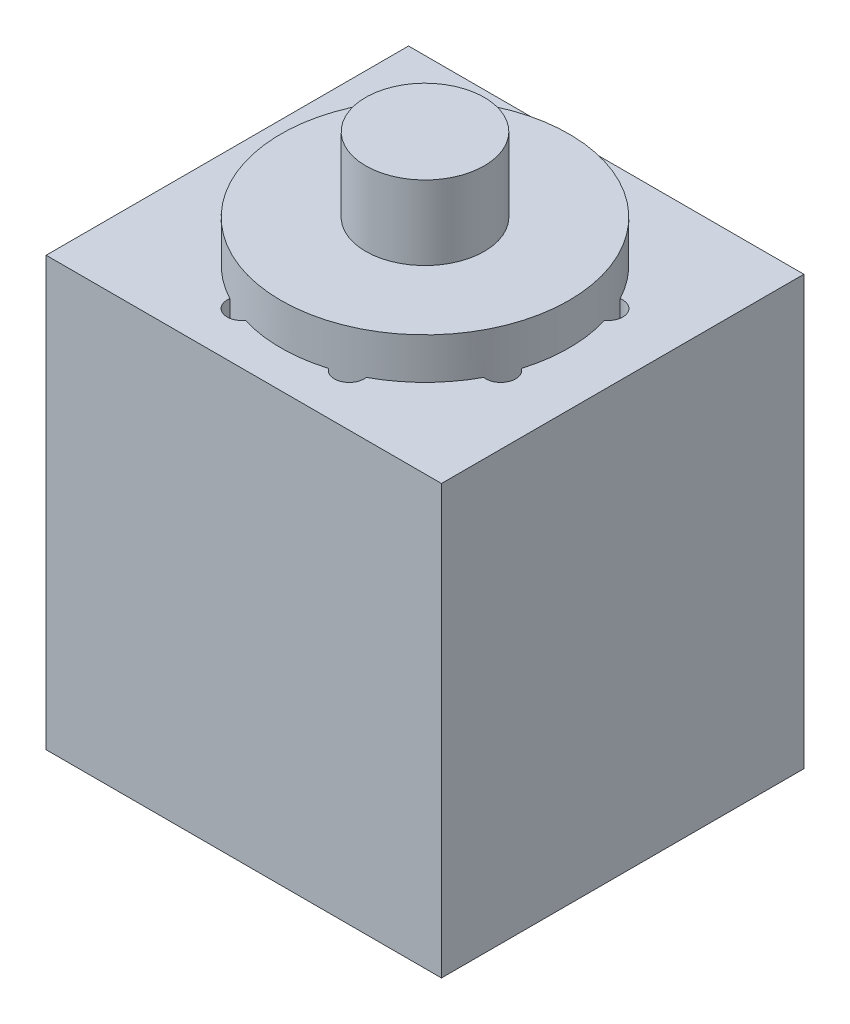
ISO-10303-21;
HEADER;
FILE_DESCRIPTION(('STEP AP214'),'2;1');
FILE_NAME('part.step','',(''),(''),'','','');
FILE_SCHEMA(('AUTOMOTIVE_DESIGN { 1 0 10303 214 1 1 1 1 }'));
ENDSEC;
DATA;
#1=APPLICATION_CONTEXT('core data for automotive mechanical design processes');
#2=APPLICATION_PROTOCOL_DEFINITION('international standard','automotive_design',2000,#1);
#3=PRODUCT_CONTEXT('',#1,'mechanical');
#4=PRODUCT('Part','Part','',(#3));
#5=PRODUCT_RELATED_PRODUCT_CATEGORY('part','',(#4));
#6=PRODUCT_DEFINITION_FORMATION('','',#4);
#7=PRODUCT_DEFINITION_CONTEXT('part definition',#1,'design');
#8=PRODUCT_DEFINITION('design','',#6,#7);
#9=PRODUCT_DEFINITION_SHAPE('','',#8);
#10=(LENGTH_UNIT() NAMED_UNIT(*) SI_UNIT(.MILLI.,.METRE.));
#11=(NAMED_UNIT(*) PLANE_ANGLE_UNIT() SI_UNIT($,.RADIAN.));
#12=(NAMED_UNIT(*) SI_UNIT($,.STERADIAN.) SOLID_ANGLE_UNIT());
#13=UNCERTAINTY_MEASURE_WITH_UNIT(LENGTH_MEASURE(1.E-05),#10,'distance_accuracy_value','');
#14=(GEOMETRIC_REPRESENTATION_CONTEXT(3) GLOBAL_UNCERTAINTY_ASSIGNED_CONTEXT((#13)) GLOBAL_UNIT_ASSIGNED_CONTEXT((#10,
#11,#12)) REPRESENTATION_CONTEXT('',''));
#15=CARTESIAN_POINT('',(0.,0.,0.));
#16=DIRECTION('',(0.,0.,1.));
#17=DIRECTION('',(1.,0.,0.));
#18=AXIS2_PLACEMENT_3D('',#15,#16,#17);
#19=CARTESIAN_POINT('',(78.5297602634594,260.,-32.5280917510326));
#20=DIRECTION('',(0.,-1.,0.));
#21=DIRECTION('',(0.,0.,-1.));
#22=AXIS2_PLACEMENT_3D('',#19,#20,#21);
#23=CYLINDRICAL_SURFACE('',#22,9.);
#24=CARTESIAN_POINT('',(78.5297602634594,260.,-32.5280917510326));
#25=DIRECTION('',(0.,1.,0.));
#26=DIRECTION('',(0.,0.,1.));
#27=AXIS2_PLACEMENT_3D('',#24,#25,#26);
#28=CIRCLE('',#27,9.);
#29=CARTESIAN_POINT('',(83.785914847198,260.,-25.222420050782));
#30=VERTEX_POINT('',#29);
#31=CARTESIAN_POINT('',(77.0805328122158,260.,-41.4106443005289));
#32=VERTEX_POINT('',#31);
#33=EDGE_CURVE('E249',#30,#32,#28,.T.);
#34=ORIENTED_EDGE('',*,*,#33,.T.);
#35=DIRECTION('',(0.,-1.,0.));
#36=VECTOR('',#35,1.);
#37=CARTESIAN_POINT('',(77.0805328122158,142.5,-41.4106443005289));
#38=LINE('',#37,#36);
#39=CARTESIAN_POINT('',(77.0805328122158,0.,-41.4106443005289));
#40=VERTEX_POINT('',#39);
#41=EDGE_CURVE('E331',#32,#40,#38,.T.);
#42=ORIENTED_EDGE('',*,*,#41,.T.);
#43=CARTESIAN_POINT('',(78.5297602634594,0.,-32.5280917510326));
#44=DIRECTION('',(0.,1.,0.));
#45=DIRECTION('',(0.,0.,1.));
#46=AXIS2_PLACEMENT_3D('',#43,#44,#45);
#47=CIRCLE('',#46,9.);
#48=CARTESIAN_POINT('',(83.785914847198,0.,-25.222420050782));
#49=VERTEX_POINT('',#48);
#50=EDGE_CURVE('E246',#49,#40,#47,.T.);
#51=ORIENTED_EDGE('',*,*,#50,.F.);
#52=DIRECTION('',(0.,-1.,0.));
#53=VECTOR('',#52,1.);
#54=CARTESIAN_POINT('',(83.785914847198,142.5,-25.222420050782));
#55=LINE('',#54,#53);
#56=EDGE_CURVE('E198',#49,#30,#55,.F.);
#57=ORIENTED_EDGE('',*,*,#56,.T.);
#58=EDGE_LOOP('',(#34,#42,#51,#57));
#59=FACE_BOUND('',#58,.T.);
#60=ADVANCED_FACE('F39',(#59),#23,.F.);
#61=CARTESIAN_POINT('',(32.5280917510326,260.,-78.5297602634594));
#62=DIRECTION('',(0.,-1.,0.));
#63=DIRECTION('',(0.,0.,-1.));
#64=AXIS2_PLACEMENT_3D('',#61,#62,#63);
#65=CYLINDRICAL_SURFACE('',#64,9.00000000000001);
#66=CARTESIAN_POINT('',(32.5280917510326,260.,-78.5297602634594));
#67=DIRECTION('',(0.,1.,0.));
#68=DIRECTION('',(0.,0.,1.));
#69=AXIS2_PLACEMENT_3D('',#66,#67,#68);
#70=CIRCLE('',#69,9.00000000000001);
#71=CARTESIAN_POINT('',(41.4106443005289,260.,-77.0805328122158));
#72=VERTEX_POINT('',#71);
#73=CARTESIAN_POINT('',(25.222420050782,260.,-83.785914847198));
#74=VERTEX_POINT('',#73);
#75=EDGE_CURVE('E243',#72,#74,#70,.T.);
#76=ORIENTED_EDGE('',*,*,#75,.T.);
#77=DIRECTION('',(0.,-1.,0.));
#78=VECTOR('',#77,1.);
#79=CARTESIAN_POINT('',(25.222420050782,142.5,-83.785914847198));
#80=LINE('',#79,#78);
#81=CARTESIAN_POINT('',(25.2224200507818,0.,-83.785914847198));
#82=VERTEX_POINT('',#81);
#83=EDGE_CURVE('E324',#74,#82,#80,.T.);
#84=ORIENTED_EDGE('',*,*,#83,.T.);
#85=CARTESIAN_POINT('',(32.5280917510326,0.,-78.5297602634594));
#86=DIRECTION('',(0.,1.,0.));
#87=DIRECTION('',(0.,0.,1.));
#88=AXIS2_PLACEMENT_3D('',#85,#86,#87);
#89=CIRCLE('',#88,9.00000000000001);
#90=CARTESIAN_POINT('',(41.410644300529,0.,-77.0805328122157));
#91=VERTEX_POINT('',#90);
#92=EDGE_CURVE('E240',#91,#82,#89,.T.);
#93=ORIENTED_EDGE('',*,*,#92,.F.);
#94=DIRECTION('',(0.,-1.,0.));
#95=VECTOR('',#94,1.);
#96=CARTESIAN_POINT('',(41.4106443005289,142.5,-77.0805328122158));
#97=LINE('',#96,#95);
#98=EDGE_CURVE('E328',#91,#72,#97,.F.);
#99=ORIENTED_EDGE('',*,*,#98,.T.);
#100=EDGE_LOOP('',(#76,#84,#93,#99));
#101=FACE_BOUND('',#100,.T.);
#102=ADVANCED_FACE('F396',(#101),#65,.F.);
#103=CARTESIAN_POINT('',(-32.5280917510326,260.,-78.5297602634594));
#104=DIRECTION('',(0.,-1.,0.));
#105=DIRECTION('',(0.,0.,-1.));
#106=AXIS2_PLACEMENT_3D('',#103,#104,#105);
#107=CYLINDRICAL_SURFACE('',#106,9.00000000000001);
#108=CARTESIAN_POINT('',(-32.5280917510326,260.,-78.5297602634594));
#109=DIRECTION('',(0.,1.,0.));
#110=DIRECTION('',(0.,0.,1.));
#111=AXIS2_PLACEMENT_3D('',#108,#109,#110);
#112=CIRCLE('',#111,9.00000000000001);
#113=CARTESIAN_POINT('',(-25.2224200507819,260.,-83.785914847198));
#114=VERTEX_POINT('',#113);
#115=CARTESIAN_POINT('',(-41.4106443005289,260.,-77.0805328122158));
#116=VERTEX_POINT('',#115);
#117=EDGE_CURVE('E237',#114,#116,#112,.T.);
#118=ORIENTED_EDGE('',*,*,#117,.T.);
#119=DIRECTION('',(0.,-1.,0.));
#120=VECTOR('',#119,1.);
#121=CARTESIAN_POINT('',(-41.4106443005289,142.5,-77.0805328122158));
#122=LINE('',#121,#120);
#123=CARTESIAN_POINT('',(-41.410644300529,0.,-77.0805328122157));
#124=VERTEX_POINT('',#123);
#125=EDGE_CURVE('E317',#116,#124,#122,.T.);
#126=ORIENTED_EDGE('',*,*,#125,.T.);
#127=CARTESIAN_POINT('',(-32.5280917510326,0.,-78.5297602634594));
#128=DIRECTION('',(0.,1.,0.));
#129=DIRECTION('',(0.,0.,1.));
#130=AXIS2_PLACEMENT_3D('',#127,#128,#129);
#131=CIRCLE('',#130,9.00000000000001);
#132=CARTESIAN_POINT('',(-25.2224200507818,0.,-83.785914847198));
#133=VERTEX_POINT('',#132);
#134=EDGE_CURVE('E234',#133,#124,#131,.T.);
#135=ORIENTED_EDGE('',*,*,#134,.F.);
#136=DIRECTION('',(0.,-1.,0.));
#137=VECTOR('',#136,1.);
#138=CARTESIAN_POINT('',(-25.2224200507819,142.5,-83.785914847198));
#139=LINE('',#138,#137);
#140=EDGE_CURVE('E321',#133,#114,#139,.F.);
#141=ORIENTED_EDGE('',*,*,#140,.T.);
#142=EDGE_LOOP('',(#118,#126,#135,#141));
#143=FACE_BOUND('',#142,.T.);
#144=ADVANCED_FACE('F356',(#143),#107,.F.);
#145=CARTESIAN_POINT('',(-78.5297602634594,260.,-32.5280917510326));
#146=DIRECTION('',(0.,-1.,0.));
#147=DIRECTION('',(0.,0.,-1.));
#148=AXIS2_PLACEMENT_3D('',#145,#146,#147);
#149=CYLINDRICAL_SURFACE('',#148,9.);
#150=CARTESIAN_POINT('',(-78.5297602634594,260.,-32.5280917510326));
#151=DIRECTION('',(0.,1.,0.));
#152=DIRECTION('',(0.,0.,1.));
#153=AXIS2_PLACEMENT_3D('',#150,#151,#152);
#154=CIRCLE('',#153,9.);
#155=CARTESIAN_POINT('',(-77.0805328122158,260.,-41.4106443005289));
#156=VERTEX_POINT('',#155);
#157=CARTESIAN_POINT('',(-83.785914847198,260.,-25.222420050782));
#158=VERTEX_POINT('',#157);
#159=EDGE_CURVE('E231',#156,#158,#154,.T.);
#160=ORIENTED_EDGE('',*,*,#159,.T.);
#161=DIRECTION('',(0.,-1.,0.));
#162=VECTOR('',#161,1.);
#163=CARTESIAN_POINT('',(-83.785914847198,142.5,-25.222420050782));
#164=LINE('',#163,#162);
#165=CARTESIAN_POINT('',(-83.785914847198,0.,-25.222420050782));
#166=VERTEX_POINT('',#165);
#167=EDGE_CURVE('E309',#158,#166,#164,.T.);
#168=ORIENTED_EDGE('',*,*,#167,.T.);
#169=CARTESIAN_POINT('',(-78.5297602634594,0.,-32.5280917510326));
#170=DIRECTION('',(0.,1.,0.));
#171=DIRECTION('',(0.,0.,1.));
#172=AXIS2_PLACEMENT_3D('',#169,#170,#171);
#173=CIRCLE('',#172,9.);
#174=CARTESIAN_POINT('',(-77.0805328122158,0.,-41.4106443005289));
#175=VERTEX_POINT('',#174);
#176=EDGE_CURVE('E228',#175,#166,#173,.T.);
#177=ORIENTED_EDGE('',*,*,#176,.F.);
#178=DIRECTION('',(0.,-1.,0.));
#179=VECTOR('',#178,1.);
#180=CARTESIAN_POINT('',(-77.0805328122158,142.5,-41.4106443005289));
#181=LINE('',#180,#179);
#182=EDGE_CURVE('E314',#175,#156,#181,.F.);
#183=ORIENTED_EDGE('',*,*,#182,.T.);
#184=EDGE_LOOP('',(#160,#168,#177,#183));
#185=FACE_BOUND('',#184,.T.);
#186=ADVANCED_FACE('F361',(#185),#149,.F.);
#187=CARTESIAN_POINT('',(-78.5297602634594,260.,32.5280917510326));
#188=DIRECTION('',(0.,-1.,0.));
#189=DIRECTION('',(0.,0.,-1.));
#190=AXIS2_PLACEMENT_3D('',#187,#188,#189);
#191=CYLINDRICAL_SURFACE('',#190,8.99999999999998);
#192=CARTESIAN_POINT('',(-78.5297602634594,260.,32.5280917510326));
#193=DIRECTION('',(0.,1.,0.));
#194=DIRECTION('',(0.,0.,1.));
#195=AXIS2_PLACEMENT_3D('',#192,#193,#194);
#196=CIRCLE('',#195,8.99999999999998);
#197=CARTESIAN_POINT('',(-83.785914847198,260.,25.222420050782));
#198=VERTEX_POINT('',#197);
#199=CARTESIAN_POINT('',(-77.0805328122158,260.,41.4106443005288));
#200=VERTEX_POINT('',#199);
#201=EDGE_CURVE('E225',#198,#200,#196,.T.);
#202=ORIENTED_EDGE('',*,*,#201,.T.);
#203=DIRECTION('',(0.,-1.,0.));
#204=VECTOR('',#203,1.);
#205=CARTESIAN_POINT('',(-77.0805328122158,142.5,41.4106443005288));
#206=LINE('',#205,#204);
#207=CARTESIAN_POINT('',(-77.0805328122158,0.,41.4106443005288));
#208=VERTEX_POINT('',#207);
#209=EDGE_CURVE('E301',#200,#208,#206,.T.);
#210=ORIENTED_EDGE('',*,*,#209,.T.);
#211=CARTESIAN_POINT('',(-78.5297602634594,0.,32.5280917510326));
#212=DIRECTION('',(0.,1.,0.));
#213=DIRECTION('',(0.,0.,1.));
#214=AXIS2_PLACEMENT_3D('',#211,#212,#213);
#215=CIRCLE('',#214,8.99999999999998);
#216=CARTESIAN_POINT('',(-83.785914847198,0.,25.222420050782));
#217=VERTEX_POINT('',#216);
#218=EDGE_CURVE('E222',#217,#208,#215,.T.);
#219=ORIENTED_EDGE('',*,*,#218,.F.);
#220=DIRECTION('',(0.,-1.,0.));
#221=VECTOR('',#220,1.);
#222=CARTESIAN_POINT('',(-83.785914847198,142.5,25.222420050782));
#223=LINE('',#222,#221);
#224=EDGE_CURVE('E306',#217,#198,#223,.F.);
#225=ORIENTED_EDGE('',*,*,#224,.T.);
#226=EDGE_LOOP('',(#202,#210,#219,#225));
#227=FACE_BOUND('',#226,.T.);
#228=ADVANCED_FACE('F384',(#227),#191,.F.);
#229=CARTESIAN_POINT('',(-32.5280917510326,260.,78.5297602634594));
#230=DIRECTION('',(0.,-1.,0.));
#231=DIRECTION('',(0.,0.,-1.));
#232=AXIS2_PLACEMENT_3D('',#229,#230,#231);
#233=CYLINDRICAL_SURFACE('',#232,9.00000000000002);
#234=CARTESIAN_POINT('',(-32.5280917510326,260.,78.5297602634594));
#235=DIRECTION('',(0.,1.,0.));
#236=DIRECTION('',(0.,0.,1.));
#237=AXIS2_PLACEMENT_3D('',#234,#235,#236);
#238=CIRCLE('',#237,9.00000000000002);
#239=CARTESIAN_POINT('',(-41.4106443005289,260.,77.0805328122158));
#240=VERTEX_POINT('',#239);
#241=CARTESIAN_POINT('',(-25.2224200507819,260.,83.785914847198));
#242=VERTEX_POINT('',#241);
#243=EDGE_CURVE('E219',#240,#242,#238,.T.);
#244=ORIENTED_EDGE('',*,*,#243,.T.);
#245=DIRECTION('',(0.,-1.,0.));
#246=VECTOR('',#245,1.);
#247=CARTESIAN_POINT('',(-25.2224200507819,142.5,83.785914847198));
#248=LINE('',#247,#246);
#249=CARTESIAN_POINT('',(-25.2224200507818,0.,83.785914847198));
#250=VERTEX_POINT('',#249);
#251=EDGE_CURVE('E296',#242,#250,#248,.T.);
#252=ORIENTED_EDGE('',*,*,#251,.T.);
#253=CARTESIAN_POINT('',(-32.5280917510326,0.,78.5297602634594));
#254=DIRECTION('',(0.,1.,0.));
#255=DIRECTION('',(0.,0.,1.));
#256=AXIS2_PLACEMENT_3D('',#253,#254,#255);
#257=CIRCLE('',#256,9.00000000000002);
#258=CARTESIAN_POINT('',(-41.410644300529,0.,77.0805328122157));
#259=VERTEX_POINT('',#258);
#260=EDGE_CURVE('E212',#259,#250,#257,.T.);
#261=ORIENTED_EDGE('',*,*,#260,.F.);
#262=DIRECTION('',(0.,-1.,0.));
#263=VECTOR('',#262,1.);
#264=CARTESIAN_POINT('',(-41.4106443005289,142.5,77.0805328122158));
#265=LINE('',#264,#263);
#266=EDGE_CURVE('E299',#259,#240,#265,.F.);
#267=ORIENTED_EDGE('',*,*,#266,.T.);
#268=EDGE_LOOP('',(#244,#252,#261,#267));
#269=FACE_BOUND('',#268,.T.);
#270=ADVANCED_FACE('F381',(#269),#233,.F.);
#271=CARTESIAN_POINT('',(32.5280917510326,260.,78.5297602634594));
#272=DIRECTION('',(0.,-1.,0.));
#273=DIRECTION('',(0.,0.,-1.));
#274=AXIS2_PLACEMENT_3D('',#271,#272,#273);
#275=CYLINDRICAL_SURFACE('',#274,9.00000000000002);
#276=CARTESIAN_POINT('',(32.5280917510326,260.,78.5297602634594));
#277=DIRECTION('',(0.,1.,0.));
#278=DIRECTION('',(0.,0.,1.));
#279=AXIS2_PLACEMENT_3D('',#276,#277,#278);
#280=CIRCLE('',#279,9.00000000000002);
#281=CARTESIAN_POINT('',(25.2224200507819,260.,83.785914847198));
#282=VERTEX_POINT('',#281);
#283=CARTESIAN_POINT('',(41.4106443005289,260.,77.0805328122158));
#284=VERTEX_POINT('',#283);
#285=EDGE_CURVE('E209',#282,#284,#280,.T.);
#286=ORIENTED_EDGE('',*,*,#285,.T.);
#287=DIRECTION('',(0.,-1.,0.));
#288=VECTOR('',#287,1.);
#289=CARTESIAN_POINT('',(41.4106443005289,142.5,77.0805328122158));
#290=LINE('',#289,#288);
#291=CARTESIAN_POINT('',(41.410644300529,0.,77.0805328122157));
#292=VERTEX_POINT('',#291);
#293=EDGE_CURVE('E208',#284,#292,#290,.T.);
#294=ORIENTED_EDGE('',*,*,#293,.T.);
#295=CARTESIAN_POINT('',(32.5280917510326,0.,78.5297602634594));
#296=DIRECTION('',(0.,1.,0.));
#297=DIRECTION('',(0.,0.,1.));
#298=AXIS2_PLACEMENT_3D('',#295,#296,#297);
#299=CIRCLE('',#298,9.00000000000002);
#300=CARTESIAN_POINT('',(25.2224200507818,0.,83.785914847198));
#301=VERTEX_POINT('',#300);
#302=EDGE_CURVE('E203',#301,#292,#299,.T.);
#303=ORIENTED_EDGE('',*,*,#302,.F.);
#304=DIRECTION('',(0.,-1.,0.));
#305=VECTOR('',#304,1.);
#306=CARTESIAN_POINT('',(25.2224200507819,142.5,83.785914847198));
#307=LINE('',#306,#305);
#308=EDGE_CURVE('E186',#301,#282,#307,.F.);
#309=ORIENTED_EDGE('',*,*,#308,.T.);
#310=EDGE_LOOP('',(#286,#294,#303,#309));
#311=FACE_BOUND('',#310,.T.);
#312=ADVANCED_FACE('F207',(#311),#275,.F.);
#313=CARTESIAN_POINT('',(78.5297602634594,260.,32.5280917510326));
#314=DIRECTION('',(0.,-1.,0.));
#315=DIRECTION('',(0.,0.,-1.));
#316=AXIS2_PLACEMENT_3D('',#313,#314,#315);
#317=CYLINDRICAL_SURFACE('',#316,9.00000000000001);
#318=CARTESIAN_POINT('',(78.5297602634594,260.,32.5280917510326));
#319=DIRECTION('',(0.,1.,0.));
#320=DIRECTION('',(0.,0.,1.));
#321=AXIS2_PLACEMENT_3D('',#318,#319,#320);
#322=CIRCLE('',#321,9.00000000000001);
#323=CARTESIAN_POINT('',(77.0805328122158,260.,41.4106443005289));
#324=VERTEX_POINT('',#323);
#325=CARTESIAN_POINT('',(83.785914847198,260.,25.2224200507819));
#326=VERTEX_POINT('',#325);
#327=EDGE_CURVE('E210',#324,#326,#322,.T.);
#328=ORIENTED_EDGE('',*,*,#327,.T.);
#329=DIRECTION('',(0.,-1.,0.));
#330=VECTOR('',#329,1.);
#331=CARTESIAN_POINT('',(83.785914847198,142.5,25.2224200507819));
#332=LINE('',#331,#330);
#333=CARTESIAN_POINT('',(83.785914847198,0.,25.2224200507818));
#334=VERTEX_POINT('',#333);
#335=EDGE_CURVE('E11',#326,#334,#332,.T.);
#336=ORIENTED_EDGE('',*,*,#335,.T.);
#337=CARTESIAN_POINT('',(78.5297602634594,0.,32.5280917510326));
#338=DIRECTION('',(0.,1.,0.));
#339=DIRECTION('',(0.,0.,1.));
#340=AXIS2_PLACEMENT_3D('',#337,#338,#339);
#341=CIRCLE('',#340,9.00000000000001);
#342=CARTESIAN_POINT('',(77.0805328122158,0.,41.4106443005289));
#343=VERTEX_POINT('',#342);
#344=EDGE_CURVE('E215',#343,#334,#341,.T.);
#345=ORIENTED_EDGE('',*,*,#344,.F.);
#346=DIRECTION('',(0.,-1.,0.));
#347=VECTOR('',#346,1.);
#348=CARTESIAN_POINT('',(77.0805328122158,142.5,41.4106443005289));
#349=LINE('',#348,#347);
#350=EDGE_CURVE('E48',#343,#324,#349,.F.);
#351=ORIENTED_EDGE('',*,*,#350,.T.);
#352=EDGE_LOOP('',(#328,#336,#345,#351));
#353=FACE_BOUND('',#352,.T.);
#354=ADVANCED_FACE('F281',(#353),#317,.F.);
#355=CARTESIAN_POINT('',(0.,260.,0.));
#356=DIRECTION('',(0.,-1.,0.));
#357=DIRECTION('',(0.,0.,-1.));
#358=AXIS2_PLACEMENT_3D('',#355,#356,#357);
#359=PLANE('',#358);
#360=CARTESIAN_POINT('',(0.,260.,0.));
#361=DIRECTION('',(0.,-1.,0.));
#362=DIRECTION('',(0.,0.,-1.));
#363=AXIS2_PLACEMENT_3D('',#360,#361,#362);
#364=CIRCLE('',#363,87.5);
#365=EDGE_CURVE('E310',#116,#156,#364,.F.);
#366=ORIENTED_EDGE('',*,*,#365,.F.);
#367=ORIENTED_EDGE('',*,*,#117,.F.);
#368=EDGE_CURVE('E318',#74,#114,#364,.F.);
#369=ORIENTED_EDGE('',*,*,#368,.F.);
#370=ORIENTED_EDGE('',*,*,#75,.F.);
#371=EDGE_CURVE('E295',#32,#72,#364,.F.);
#372=ORIENTED_EDGE('',*,*,#371,.F.);
#373=ORIENTED_EDGE('',*,*,#33,.F.);
#374=EDGE_CURVE('E289',#326,#30,#364,.F.);
#375=ORIENTED_EDGE('',*,*,#374,.F.);
#376=ORIENTED_EDGE('',*,*,#327,.F.);
#377=EDGE_CURVE('E287',#284,#324,#364,.F.);
#378=ORIENTED_EDGE('',*,*,#377,.F.);
#379=ORIENTED_EDGE('',*,*,#285,.F.);
#380=EDGE_CURVE('E193',#242,#282,#364,.F.);
#381=ORIENTED_EDGE('',*,*,#380,.F.);
#382=ORIENTED_EDGE('',*,*,#243,.F.);
#383=EDGE_CURVE('E297',#200,#240,#364,.F.);
#384=ORIENTED_EDGE('',*,*,#383,.F.);
#385=ORIENTED_EDGE('',*,*,#201,.F.);
#386=EDGE_CURVE('E302',#158,#198,#364,.F.);
#387=ORIENTED_EDGE('',*,*,#386,.F.);
#388=ORIENTED_EDGE('',*,*,#159,.F.);
#389=EDGE_LOOP('',(#366,#367,#369,#370,#372,#373,#375,#376,#378,#379,#381,#382,#384,#385,#387,#388));
#390=FACE_BOUND('',#389,.T.);
#391=DIRECTION('',(0.,0.,-1.));
#392=VECTOR('',#391,1.);
#393=CARTESIAN_POINT('',(120.,260.,110.));
#394=LINE('',#393,#392);
#395=CARTESIAN_POINT('',(120.,260.,110.));
#396=VERTEX_POINT('',#395);
#397=CARTESIAN_POINT('',(120.,260.,-110.));
#398=VERTEX_POINT('',#397);
#399=EDGE_CURVE('E255',#396,#398,#394,.T.);
#400=ORIENTED_EDGE('',*,*,#399,.T.);
#401=DIRECTION('',(-1.,0.,0.));
#402=VECTOR('',#401,1.);
#403=CARTESIAN_POINT('',(-120.,260.,-110.));
#404=LINE('',#403,#402);
#405=CARTESIAN_POINT('',(-120.,260.,-110.));
#406=VERTEX_POINT('',#405);
#407=EDGE_CURVE('E92',#398,#406,#404,.T.);
#408=ORIENTED_EDGE('',*,*,#407,.T.);
#409=DIRECTION('',(0.,0.,1.));
#410=VECTOR('',#409,1.);
#411=CARTESIAN_POINT('',(-120.,260.,110.));
#412=LINE('',#411,#410);
#413=CARTESIAN_POINT('',(-120.,260.,110.));
#414=VERTEX_POINT('',#413);
#415=EDGE_CURVE('E258',#406,#414,#412,.T.);
#416=ORIENTED_EDGE('',*,*,#415,.T.);
#417=DIRECTION('',(1.,0.,0.));
#418=VECTOR('',#417,1.);
#419=CARTESIAN_POINT('',(-120.,260.,110.));
#420=LINE('',#419,#418);
#421=EDGE_CURVE('E63',#414,#396,#420,.T.);
#422=ORIENTED_EDGE('',*,*,#421,.T.);
#423=EDGE_LOOP('',(#400,#408,#416,#422));
#424=FACE_BOUND('',#423,.T.);
#425=ADVANCED_FACE('F286',(#390,#424),#359,.F.);
#426=CARTESIAN_POINT('',(0.,0.,0.));
#427=DIRECTION('',(0.,-1.,0.));
#428=DIRECTION('',(0.,0.,-1.));
#429=AXIS2_PLACEMENT_3D('',#426,#427,#428);
#430=PLANE('',#429);
#431=CARTESIAN_POINT('',(0.,0.,0.));
#432=DIRECTION('',(0.,1.,0.));
#433=DIRECTION('',(0.,0.,1.));
#434=AXIS2_PLACEMENT_3D('',#431,#432,#433);
#435=CIRCLE('',#434,87.5);
#436=EDGE_CURVE('E364',#175,#166,#435,.T.);
#437=ORIENTED_EDGE('',*,*,#436,.F.);
#438=ORIENTED_EDGE('',*,*,#176,.T.);
#439=EDGE_LOOP('',(#437,#438));
#440=FACE_BOUND('',#439,.T.);
#441=EDGE_CURVE('E366',#217,#208,#435,.T.);
#442=ORIENTED_EDGE('',*,*,#441,.F.);
#443=ORIENTED_EDGE('',*,*,#218,.T.);
#444=EDGE_LOOP('',(#442,#443));
#445=FACE_BOUND('',#444,.T.);
#446=EDGE_CURVE('E206',#259,#250,#435,.T.);
#447=ORIENTED_EDGE('',*,*,#446,.F.);
#448=ORIENTED_EDGE('',*,*,#260,.T.);
#449=EDGE_LOOP('',(#447,#448));
#450=FACE_BOUND('',#449,.T.);
#451=EDGE_CURVE('E190',#301,#292,#435,.T.);
#452=ORIENTED_EDGE('',*,*,#451,.F.);
#453=ORIENTED_EDGE('',*,*,#302,.T.);
#454=EDGE_LOOP('',(#452,#453));
#455=FACE_BOUND('',#454,.T.);
#456=EDGE_CURVE('E54',#343,#334,#435,.T.);
#457=ORIENTED_EDGE('',*,*,#456,.F.);
#458=ORIENTED_EDGE('',*,*,#344,.T.);
#459=EDGE_LOOP('',(#457,#458));
#460=FACE_BOUND('',#459,.T.);
#461=EDGE_CURVE('E345',#49,#40,#435,.T.);
#462=ORIENTED_EDGE('',*,*,#461,.F.);
#463=ORIENTED_EDGE('',*,*,#50,.T.);
#464=EDGE_LOOP('',(#462,#463));
#465=FACE_BOUND('',#464,.T.);
#466=EDGE_CURVE('E349',#91,#82,#435,.T.);
#467=ORIENTED_EDGE('',*,*,#466,.F.);
#468=ORIENTED_EDGE('',*,*,#92,.T.);
#469=EDGE_LOOP('',(#467,#468));
#470=FACE_BOUND('',#469,.T.);
#471=DIRECTION('',(0.,0.,-1.));
#472=VECTOR('',#471,1.);
#473=CARTESIAN_POINT('',(120.,0.,110.));
#474=LINE('',#473,#472);
#475=CARTESIAN_POINT('',(120.,0.,110.));
#476=VERTEX_POINT('',#475);
#477=CARTESIAN_POINT('',(120.,0.,-110.));
#478=VERTEX_POINT('',#477);
#479=EDGE_CURVE('E252',#476,#478,#474,.T.);
#480=ORIENTED_EDGE('',*,*,#479,.F.);
#481=DIRECTION('',(1.,0.,0.));
#482=VECTOR('',#481,1.);
#483=CARTESIAN_POINT('',(-120.,0.,110.));
#484=LINE('',#483,#482);
#485=CARTESIAN_POINT('',(-120.,0.,110.));
#486=VERTEX_POINT('',#485);
#487=EDGE_CURVE('E84',#486,#476,#484,.T.);
#488=ORIENTED_EDGE('',*,*,#487,.F.);
#489=DIRECTION('',(0.,0.,1.));
#490=VECTOR('',#489,1.);
#491=CARTESIAN_POINT('',(-120.,0.,110.));
#492=LINE('',#491,#490);
#493=CARTESIAN_POINT('',(-120.,0.,-110.));
#494=VERTEX_POINT('',#493);
#495=EDGE_CURVE('E266',#494,#486,#492,.T.);
#496=ORIENTED_EDGE('',*,*,#495,.F.);
#497=DIRECTION('',(-1.,0.,0.));
#498=VECTOR('',#497,1.);
#499=CARTESIAN_POINT('',(-120.,0.,-110.));
#500=LINE('',#499,#498);
#501=EDGE_CURVE('E264',#478,#494,#500,.T.);
#502=ORIENTED_EDGE('',*,*,#501,.F.);
#503=EDGE_LOOP('',(#480,#488,#496,#502));
#504=FACE_BOUND('',#503,.T.);
#505=ORIENTED_EDGE('',*,*,#134,.T.);
#506=EDGE_CURVE('E354',#133,#124,#435,.T.);
#507=ORIENTED_EDGE('',*,*,#506,.F.);
#508=EDGE_LOOP('',(#505,#507));
#509=FACE_BOUND('',#508,.T.);
#510=ADVANCED_FACE('F202',(#440,#445,#450,#455,#460,#465,#470,#504,#509),#430,.T.);
#511=CARTESIAN_POINT('',(120.,260.,110.));
#512=DIRECTION('',(-1.,0.,0.));
#513=DIRECTION('',(0.,0.,1.));
#514=AXIS2_PLACEMENT_3D('',#511,#512,#513);
#515=PLANE('',#514);
#516=ORIENTED_EDGE('',*,*,#479,.T.);
#517=DIRECTION('',(0.,-1.,0.));
#518=VECTOR('',#517,1.);
#519=CARTESIAN_POINT('',(120.,260.,-110.));
#520=LINE('',#519,#518);
#521=EDGE_CURVE('E275',#398,#478,#520,.T.);
#522=ORIENTED_EDGE('',*,*,#521,.F.);
#523=ORIENTED_EDGE('',*,*,#399,.F.);
#524=DIRECTION('',(0.,-1.,0.));
#525=VECTOR('',#524,1.);
#526=CARTESIAN_POINT('',(120.,260.,110.));
#527=LINE('',#526,#525);
#528=EDGE_CURVE('E261',#396,#476,#527,.T.);
#529=ORIENTED_EDGE('',*,*,#528,.T.);
#530=EDGE_LOOP('',(#516,#522,#523,#529));
#531=FACE_BOUND('',#530,.T.);
#532=ADVANCED_FACE('F41',(#531),#515,.F.);
#533=CARTESIAN_POINT('',(-120.,260.,-110.));
#534=DIRECTION('',(0.,0.,1.));
#535=DIRECTION('',(1.,0.,0.));
#536=AXIS2_PLACEMENT_3D('',#533,#534,#535);
#537=PLANE('',#536);
#538=ORIENTED_EDGE('',*,*,#501,.T.);
#539=DIRECTION('',(0.,-1.,0.));
#540=VECTOR('',#539,1.);
#541=CARTESIAN_POINT('',(-120.,260.,-110.));
#542=LINE('',#541,#540);
#543=EDGE_CURVE('E272',#406,#494,#542,.T.);
#544=ORIENTED_EDGE('',*,*,#543,.F.);
#545=ORIENTED_EDGE('',*,*,#407,.F.);
#546=ORIENTED_EDGE('',*,*,#521,.T.);
#547=EDGE_LOOP('',(#538,#544,#545,#546));
#548=FACE_BOUND('',#547,.T.);
#549=ADVANCED_FACE('F412',(#548),#537,.F.);
#550=CARTESIAN_POINT('',(-120.,260.,110.));
#551=DIRECTION('',(1.,0.,0.));
#552=DIRECTION('',(0.,0.,-1.));
#553=AXIS2_PLACEMENT_3D('',#550,#551,#552);
#554=PLANE('',#553);
#555=ORIENTED_EDGE('',*,*,#495,.T.);
#556=DIRECTION('',(0.,-1.,0.));
#557=VECTOR('',#556,1.);
#558=CARTESIAN_POINT('',(-120.,260.,110.));
#559=LINE('',#558,#557);
#560=EDGE_CURVE('E270',#414,#486,#559,.T.);
#561=ORIENTED_EDGE('',*,*,#560,.F.);
#562=ORIENTED_EDGE('',*,*,#415,.F.);
#563=ORIENTED_EDGE('',*,*,#543,.T.);
#564=EDGE_LOOP('',(#555,#561,#562,#563));
#565=FACE_BOUND('',#564,.T.);
#566=ADVANCED_FACE('F410',(#565),#554,.F.);
#567=CARTESIAN_POINT('',(-120.,260.,110.));
#568=DIRECTION('',(0.,0.,-1.));
#569=DIRECTION('',(-1.,0.,0.));
#570=AXIS2_PLACEMENT_3D('',#567,#568,#569);
#571=PLANE('',#570);
#572=ORIENTED_EDGE('',*,*,#487,.T.);
#573=ORIENTED_EDGE('',*,*,#528,.F.);
#574=ORIENTED_EDGE('',*,*,#421,.F.);
#575=ORIENTED_EDGE('',*,*,#560,.T.);
#576=EDGE_LOOP('',(#572,#573,#574,#575));
#577=FACE_BOUND('',#576,.T.);
#578=ADVANCED_FACE('F407',(#577),#571,.F.);
#579=CARTESIAN_POINT('',(0.,285.,0.));
#580=DIRECTION('',(0.,-1.,0.));
#581=DIRECTION('',(0.,0.,-1.));
#582=AXIS2_PLACEMENT_3D('',#579,#580,#581);
#583=CYLINDRICAL_SURFACE('',#582,87.5);
#584=ORIENTED_EDGE('',*,*,#41,.F.);
#585=ORIENTED_EDGE('',*,*,#371,.T.);
#586=ORIENTED_EDGE('',*,*,#98,.F.);
#587=ORIENTED_EDGE('',*,*,#466,.T.);
#588=ORIENTED_EDGE('',*,*,#83,.F.);
#589=ORIENTED_EDGE('',*,*,#368,.T.);
#590=ORIENTED_EDGE('',*,*,#140,.F.);
#591=ORIENTED_EDGE('',*,*,#506,.T.);
#592=ORIENTED_EDGE('',*,*,#125,.F.);
#593=ORIENTED_EDGE('',*,*,#365,.T.);
#594=ORIENTED_EDGE('',*,*,#182,.F.);
#595=ORIENTED_EDGE('',*,*,#436,.T.);
#596=ORIENTED_EDGE('',*,*,#167,.F.);
#597=ORIENTED_EDGE('',*,*,#386,.T.);
#598=ORIENTED_EDGE('',*,*,#224,.F.);
#599=ORIENTED_EDGE('',*,*,#441,.T.);
#600=ORIENTED_EDGE('',*,*,#209,.F.);
#601=ORIENTED_EDGE('',*,*,#383,.T.);
#602=ORIENTED_EDGE('',*,*,#266,.F.);
#603=ORIENTED_EDGE('',*,*,#446,.T.);
#604=ORIENTED_EDGE('',*,*,#251,.F.);
#605=ORIENTED_EDGE('',*,*,#380,.T.);
#606=ORIENTED_EDGE('',*,*,#308,.F.);
#607=ORIENTED_EDGE('',*,*,#451,.T.);
#608=ORIENTED_EDGE('',*,*,#293,.F.);
#609=ORIENTED_EDGE('',*,*,#377,.T.);
#610=ORIENTED_EDGE('',*,*,#350,.F.);
#611=ORIENTED_EDGE('',*,*,#456,.T.);
#612=ORIENTED_EDGE('',*,*,#335,.F.);
#613=ORIENTED_EDGE('',*,*,#374,.T.);
#614=ORIENTED_EDGE('',*,*,#56,.F.);
#615=ORIENTED_EDGE('',*,*,#461,.T.);
#616=EDGE_LOOP('',(#584,#585,#586,#587,#588,#589,#590,#591,#592,#593,#594,#595,#596,#597,#598,
#599,#600,#601,#602,#603,#604,#605,#606,#607,#608,#609,#610,#611,#612,#613,#614,#615));
#617=FACE_BOUND('',#616,.T.);
#618=CARTESIAN_POINT('',(0.,285.,0.));
#619=DIRECTION('',(0.,1.,0.));
#620=DIRECTION('',(0.,0.,1.));
#621=AXIS2_PLACEMENT_3D('',#618,#619,#620);
#622=CIRCLE('',#621,87.5);
#623=CARTESIAN_POINT('',(0.,285.,87.5));
#624=VERTEX_POINT('',#623);
#625=EDGE_CURVE('E204',#624,#624,#622,.T.);
#626=ORIENTED_EDGE('',*,*,#625,.F.);
#627=EDGE_LOOP('',(#626));
#628=FACE_BOUND('',#627,.T.);
#629=ADVANCED_FACE('F188',(#617,#628),#583,.T.);
#630=CARTESIAN_POINT('',(0.,285.,0.));
#631=DIRECTION('',(0.,1.,0.));
#632=DIRECTION('',(0.,0.,1.));
#633=AXIS2_PLACEMENT_3D('',#630,#631,#632);
#634=PLANE('',#633);
#635=CARTESIAN_POINT('',(0.,285.,0.));
#636=DIRECTION('',(0.,1.,0.));
#637=DIRECTION('',(0.,0.,1.));
#638=AXIS2_PLACEMENT_3D('',#635,#636,#637);
#639=CIRCLE('',#638,36.);
#640=CARTESIAN_POINT('',(0.,285.,36.));
#641=VERTEX_POINT('',#640);
#642=EDGE_CURVE('E43',#641,#641,#639,.F.);
#643=ORIENTED_EDGE('',*,*,#642,.T.);
#644=EDGE_LOOP('',(#643));
#645=FACE_BOUND('',#644,.T.);
#646=ORIENTED_EDGE('',*,*,#625,.T.);
#647=EDGE_LOOP('',(#646));
#648=FACE_BOUND('',#647,.T.);
#649=ADVANCED_FACE('F527',(#645,#648),#634,.T.);
#650=CARTESIAN_POINT('',(0.,330.,0.));
#651=DIRECTION('',(0.,-1.,0.));
#652=DIRECTION('',(0.,0.,-1.));
#653=AXIS2_PLACEMENT_3D('',#650,#651,#652);
#654=CYLINDRICAL_SURFACE('',#653,36.);
#655=ORIENTED_EDGE('',*,*,#642,.F.);
#656=EDGE_LOOP('',(#655));
#657=FACE_BOUND('',#656,.T.);
#658=CARTESIAN_POINT('',(0.,330.,0.));
#659=DIRECTION('',(0.,1.,0.));
#660=DIRECTION('',(0.,0.,1.));
#661=AXIS2_PLACEMENT_3D('',#658,#659,#660);
#662=CIRCLE('',#661,36.);
#663=CARTESIAN_POINT('',(0.,330.,36.));
#664=VERTEX_POINT('',#663);
#665=EDGE_CURVE('E370',#664,#664,#662,.T.);
#666=ORIENTED_EDGE('',*,*,#665,.F.);
#667=EDGE_LOOP('',(#666));
#668=FACE_BOUND('',#667,.T.);
#669=ADVANCED_FACE('F536',(#657,#668),#654,.T.);
#670=CARTESIAN_POINT('',(0.,330.,0.));
#671=DIRECTION('',(0.,1.,0.));
#672=DIRECTION('',(0.,0.,1.));
#673=AXIS2_PLACEMENT_3D('',#670,#671,#672);
#674=PLANE('',#673);
#675=ORIENTED_EDGE('',*,*,#665,.T.);
#676=EDGE_LOOP('',(#675));
#677=FACE_BOUND('',#676,.T.);
#678=ADVANCED_FACE('F546',(#677),#674,.T.);
#679=CLOSED_SHELL('',(#60,#102,#144,#186,#228,#270,#312,#354,#425,#510,#532,#549,#566,#578,#629,
#649,#669,#678));
#680=MANIFOLD_SOLID_BREP('B2',#679);
#681=ADVANCED_BREP_SHAPE_REPRESENTATION('',(#18,#680),#14);
#682=SHAPE_DEFINITION_REPRESENTATION(#9,#681);
ENDSEC;
END-ISO-10303-21;
